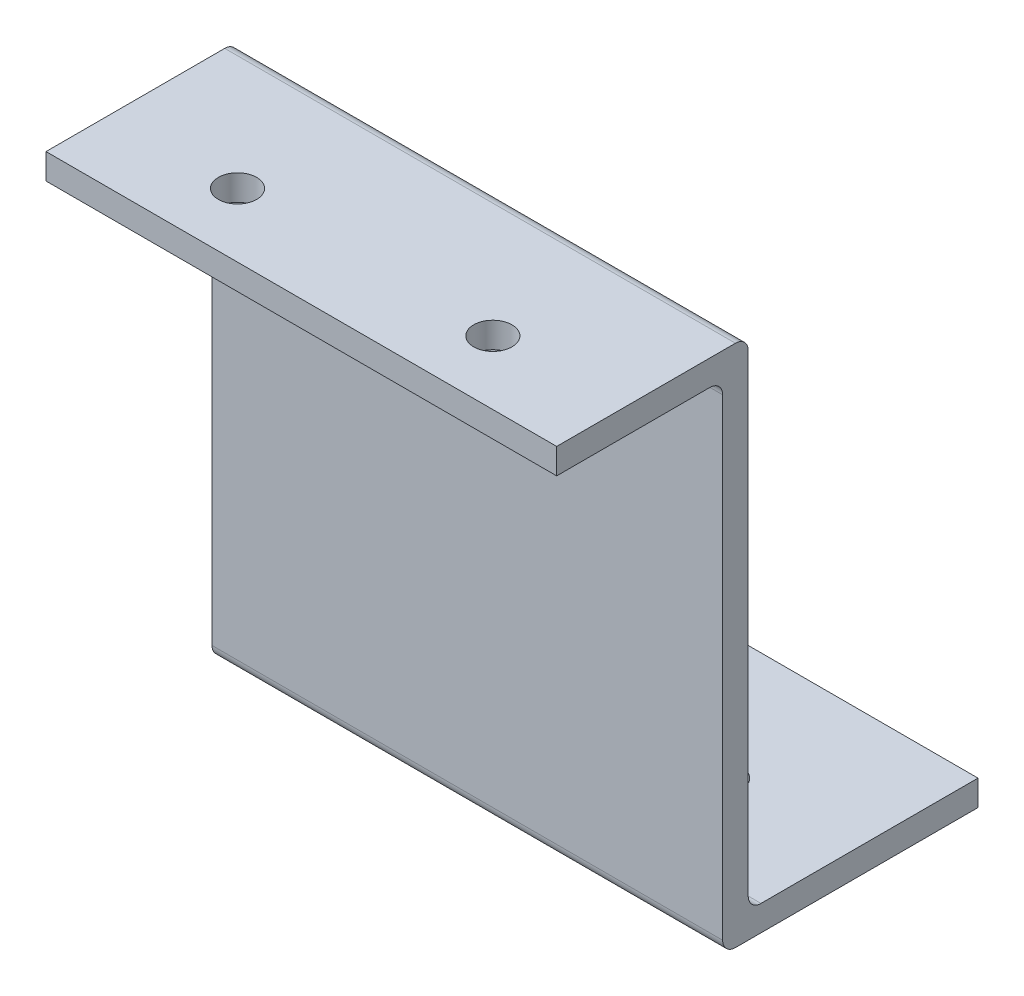
ISO-10303-21;
HEADER;
FILE_DESCRIPTION(('STEP AP214'),'2;1');
FILE_NAME('part.step','',(''),(''),'','','');
FILE_SCHEMA(('AUTOMOTIVE_DESIGN { 1 0 10303 214 1 1 1 1 }'));
ENDSEC;
DATA;
#1=APPLICATION_CONTEXT('core data for automotive mechanical design processes');
#2=APPLICATION_PROTOCOL_DEFINITION('international standard','automotive_design',2000,#1);
#3=PRODUCT_CONTEXT('',#1,'mechanical');
#4=PRODUCT('Part','Part','',(#3));
#5=PRODUCT_RELATED_PRODUCT_CATEGORY('part','',(#4));
#6=PRODUCT_DEFINITION_FORMATION('','',#4);
#7=PRODUCT_DEFINITION_CONTEXT('part definition',#1,'design');
#8=PRODUCT_DEFINITION('design','',#6,#7);
#9=PRODUCT_DEFINITION_SHAPE('','',#8);
#10=(LENGTH_UNIT() NAMED_UNIT(*) SI_UNIT(.MILLI.,.METRE.));
#11=(NAMED_UNIT(*) PLANE_ANGLE_UNIT() SI_UNIT($,.RADIAN.));
#12=(NAMED_UNIT(*) SI_UNIT($,.STERADIAN.) SOLID_ANGLE_UNIT());
#13=UNCERTAINTY_MEASURE_WITH_UNIT(LENGTH_MEASURE(1.E-05),#10,'distance_accuracy_value','');
#14=(GEOMETRIC_REPRESENTATION_CONTEXT(3) GLOBAL_UNCERTAINTY_ASSIGNED_CONTEXT((#13)) GLOBAL_UNIT_ASSIGNED_CONTEXT((#10,
#11,#12)) REPRESENTATION_CONTEXT('',''));
#15=CARTESIAN_POINT('',(0.,0.,0.));
#16=DIRECTION('',(0.,0.,1.));
#17=DIRECTION('',(1.,0.,0.));
#18=AXIS2_PLACEMENT_3D('',#15,#16,#17);
#19=CARTESIAN_POINT('',(40.,0.,0.));
#20=DIRECTION('',(0.,1.,0.));
#21=DIRECTION('',(0.,0.,1.));
#22=AXIS2_PLACEMENT_3D('',#19,#20,#21);
#23=PLANE('',#22);
#24=CARTESIAN_POINT('',(10.,0.,-5.));
#25=DIRECTION('',(0.,1.,0.));
#26=DIRECTION('',(0.,0.,1.));
#27=AXIS2_PLACEMENT_3D('',#24,#25,#26);
#28=CIRCLE('',#27,1.5);
#29=CARTESIAN_POINT('',(10.,0.,-3.5));
#30=VERTEX_POINT('',#29);
#31=EDGE_CURVE('E172',#30,#30,#28,.T.);
#32=ORIENTED_EDGE('',*,*,#31,.T.);
#33=EDGE_LOOP('',(#32));
#34=FACE_BOUND('',#33,.T.);
#35=CARTESIAN_POINT('',(30.,0.,-5.));
#36=DIRECTION('',(0.,1.,0.));
#37=DIRECTION('',(0.,0.,1.));
#38=AXIS2_PLACEMENT_3D('',#35,#36,#37);
#39=CIRCLE('',#38,1.5);
#40=CARTESIAN_POINT('',(30.,0.,-3.5));
#41=VERTEX_POINT('',#40);
#42=EDGE_CURVE('E258',#41,#41,#39,.T.);
#43=ORIENTED_EDGE('',*,*,#42,.T.);
#44=EDGE_LOOP('',(#43));
#45=FACE_BOUND('',#44,.T.);
#46=DIRECTION('',(0.,0.,-1.));
#47=VECTOR('',#46,1.);
#48=CARTESIAN_POINT('',(0.,0.,0.));
#49=LINE('',#48,#47);
#50=CARTESIAN_POINT('',(0.,0.,0.));
#51=VERTEX_POINT('',#50);
#52=CARTESIAN_POINT('',(0.,0.,-12.));
#53=VERTEX_POINT('',#52);
#54=EDGE_CURVE('E168',#51,#53,#49,.T.);
#55=ORIENTED_EDGE('',*,*,#54,.T.);
#56=DIRECTION('',(-1.,0.,0.));
#57=VECTOR('',#56,1.);
#58=CARTESIAN_POINT('',(40.,0.,-12.));
#59=LINE('',#58,#57);
#60=CARTESIAN_POINT('',(40.,0.,-12.));
#61=VERTEX_POINT('',#60);
#62=EDGE_CURVE('E210',#53,#61,#59,.F.);
#63=ORIENTED_EDGE('',*,*,#62,.T.);
#64=DIRECTION('',(0.,0.,-1.));
#65=VECTOR('',#64,1.);
#66=CARTESIAN_POINT('',(40.,0.,0.));
#67=LINE('',#66,#65);
#68=CARTESIAN_POINT('',(40.,0.,0.));
#69=VERTEX_POINT('',#68);
#70=EDGE_CURVE('E155',#69,#61,#67,.T.);
#71=ORIENTED_EDGE('',*,*,#70,.F.);
#72=DIRECTION('',(-1.,0.,0.));
#73=VECTOR('',#72,1.);
#74=CARTESIAN_POINT('',(40.,0.,0.));
#75=LINE('',#74,#73);
#76=EDGE_CURVE('E167',#69,#51,#75,.T.);
#77=ORIENTED_EDGE('',*,*,#76,.T.);
#78=EDGE_LOOP('',(#55,#63,#71,#77));
#79=FACE_BOUND('',#78,.T.);
#80=ADVANCED_FACE('F35',(#34,#45,#79),#23,.F.);
#81=CARTESIAN_POINT('',(40.,0.,-13.));
#82=DIRECTION('',(0.,0.,-1.));
#83=DIRECTION('',(-1.,0.,0.));
#84=AXIS2_PLACEMENT_3D('',#81,#82,#83);
#85=PLANE('',#84);
#86=DIRECTION('',(0.,-1.,0.));
#87=VECTOR('',#86,1.);
#88=CARTESIAN_POINT('',(0.,0.,-13.));
#89=LINE('',#88,#87);
#90=CARTESIAN_POINT('',(0.,-1.,-13.));
#91=VERTEX_POINT('',#90);
#92=CARTESIAN_POINT('',(0.,-38.,-13.));
#93=VERTEX_POINT('',#92);
#94=EDGE_CURVE('E171',#91,#93,#89,.T.);
#95=ORIENTED_EDGE('',*,*,#94,.T.);
#96=DIRECTION('',(-1.,0.,0.));
#97=VECTOR('',#96,1.);
#98=CARTESIAN_POINT('',(40.,-38.,-13.));
#99=LINE('',#98,#97);
#100=CARTESIAN_POINT('',(40.,-38.,-13.));
#101=VERTEX_POINT('',#100);
#102=EDGE_CURVE('E200',#93,#101,#99,.F.);
#103=ORIENTED_EDGE('',*,*,#102,.T.);
#104=DIRECTION('',(0.,-1.,0.));
#105=VECTOR('',#104,1.);
#106=CARTESIAN_POINT('',(40.,0.,-13.));
#107=LINE('',#106,#105);
#108=CARTESIAN_POINT('',(40.,-1.,-13.));
#109=VERTEX_POINT('',#108);
#110=EDGE_CURVE('E153',#109,#101,#107,.T.);
#111=ORIENTED_EDGE('',*,*,#110,.F.);
#112=DIRECTION('',(-1.,0.,0.));
#113=VECTOR('',#112,1.);
#114=CARTESIAN_POINT('',(0.,-1.,-13.));
#115=LINE('',#114,#113);
#116=EDGE_CURVE('E197',#109,#91,#115,.T.);
#117=ORIENTED_EDGE('',*,*,#116,.T.);
#118=EDGE_LOOP('',(#95,#103,#111,#117));
#119=FACE_BOUND('',#118,.T.);
#120=ADVANCED_FACE('F234',(#119),#85,.F.);
#121=CARTESIAN_POINT('',(40.,-39.,-1.35308431126191E-13));
#122=DIRECTION('',(0.,-1.,0.));
#123=DIRECTION('',(0.,0.,-1.));
#124=AXIS2_PLACEMENT_3D('',#121,#122,#123);
#125=PLANE('',#124);
#126=CARTESIAN_POINT('',(30.,-39.,-23.));
#127=DIRECTION('',(0.,-1.,0.));
#128=DIRECTION('',(0.,0.,-1.));
#129=AXIS2_PLACEMENT_3D('',#126,#127,#128);
#130=CIRCLE('',#129,1.5);
#131=CARTESIAN_POINT('',(30.,-39.,-24.5));
#132=VERTEX_POINT('',#131);
#133=EDGE_CURVE('E265',#132,#132,#130,.T.);
#134=ORIENTED_EDGE('',*,*,#133,.F.);
#135=EDGE_LOOP('',(#134));
#136=FACE_BOUND('',#135,.T.);
#137=CARTESIAN_POINT('',(10.,-39.,-23.));
#138=DIRECTION('',(0.,-1.,0.));
#139=DIRECTION('',(0.,0.,-1.));
#140=AXIS2_PLACEMENT_3D('',#137,#138,#139);
#141=CIRCLE('',#140,1.5);
#142=CARTESIAN_POINT('',(10.,-39.,-24.5));
#143=VERTEX_POINT('',#142);
#144=EDGE_CURVE('E270',#143,#143,#141,.T.);
#145=ORIENTED_EDGE('',*,*,#144,.F.);
#146=EDGE_LOOP('',(#145));
#147=FACE_BOUND('',#146,.T.);
#148=DIRECTION('',(0.,0.,1.));
#149=VECTOR('',#148,1.);
#150=CARTESIAN_POINT('',(40.,-39.,-1.35308431126191E-13));
#151=LINE('',#150,#149);
#152=CARTESIAN_POINT('',(40.,-39.,-33.));
#153=VERTEX_POINT('',#152);
#154=CARTESIAN_POINT('',(40.,-39.,-14.));
#155=VERTEX_POINT('',#154);
#156=EDGE_CURVE('E131',#153,#155,#151,.T.);
#157=ORIENTED_EDGE('',*,*,#156,.T.);
#158=DIRECTION('',(-1.,0.,0.));
#159=VECTOR('',#158,1.);
#160=CARTESIAN_POINT('',(0.,-39.,-14.));
#161=LINE('',#160,#159);
#162=CARTESIAN_POINT('',(0.,-39.,-14.));
#163=VERTEX_POINT('',#162);
#164=EDGE_CURVE('E138',#155,#163,#161,.T.);
#165=ORIENTED_EDGE('',*,*,#164,.T.);
#166=DIRECTION('',(0.,0.,1.));
#167=VECTOR('',#166,1.);
#168=CARTESIAN_POINT('',(0.,-39.,-1.35308431126191E-13));
#169=LINE('',#168,#167);
#170=CARTESIAN_POINT('',(0.,-39.,-33.));
#171=VERTEX_POINT('',#170);
#172=EDGE_CURVE('E134',#171,#163,#169,.T.);
#173=ORIENTED_EDGE('',*,*,#172,.F.);
#174=DIRECTION('',(-1.,0.,0.));
#175=VECTOR('',#174,1.);
#176=CARTESIAN_POINT('',(40.,-39.,-33.));
#177=LINE('',#176,#175);
#178=EDGE_CURVE('E126',#153,#171,#177,.T.);
#179=ORIENTED_EDGE('',*,*,#178,.F.);
#180=EDGE_LOOP('',(#157,#165,#173,#179));
#181=FACE_BOUND('',#180,.T.);
#182=ADVANCED_FACE('F128',(#136,#147,#181),#125,.T.);
#183=CARTESIAN_POINT('',(40.,0.,-33.));
#184=DIRECTION('',(0.,0.,1.));
#185=DIRECTION('',(1.,0.,0.));
#186=AXIS2_PLACEMENT_3D('',#183,#184,#185);
#187=PLANE('',#186);
#188=DIRECTION('',(0.,1.,0.));
#189=VECTOR('',#188,1.);
#190=CARTESIAN_POINT('',(0.,0.,-33.));
#191=LINE('',#190,#189);
#192=CARTESIAN_POINT('',(0.,-37.,-33.));
#193=VERTEX_POINT('',#192);
#194=EDGE_CURVE('E176',#171,#193,#191,.T.);
#195=ORIENTED_EDGE('',*,*,#194,.T.);
#196=DIRECTION('',(-1.,0.,0.));
#197=VECTOR('',#196,1.);
#198=CARTESIAN_POINT('',(40.,-37.,-33.));
#199=LINE('',#198,#197);
#200=CARTESIAN_POINT('',(40.,-37.,-33.));
#201=VERTEX_POINT('',#200);
#202=EDGE_CURVE('E139',#201,#193,#199,.T.);
#203=ORIENTED_EDGE('',*,*,#202,.F.);
#204=DIRECTION('',(0.,1.,0.));
#205=VECTOR('',#204,1.);
#206=CARTESIAN_POINT('',(40.,0.,-33.));
#207=LINE('',#206,#205);
#208=EDGE_CURVE('E143',#153,#201,#207,.T.);
#209=ORIENTED_EDGE('',*,*,#208,.F.);
#210=ORIENTED_EDGE('',*,*,#178,.T.);
#211=EDGE_LOOP('',(#195,#203,#209,#210));
#212=FACE_BOUND('',#211,.T.);
#213=ADVANCED_FACE('F144',(#212),#187,.F.);
#214=CARTESIAN_POINT('',(40.,-37.,0.));
#215=DIRECTION('',(0.,1.,0.));
#216=DIRECTION('',(0.,0.,1.));
#217=AXIS2_PLACEMENT_3D('',#214,#215,#216);
#218=PLANE('',#217);
#219=CARTESIAN_POINT('',(30.,-37.,-23.));
#220=DIRECTION('',(0.,1.,0.));
#221=DIRECTION('',(0.,0.,1.));
#222=AXIS2_PLACEMENT_3D('',#219,#220,#221);
#223=CIRCLE('',#222,1.5);
#224=CARTESIAN_POINT('',(30.,-37.,-21.5));
#225=VERTEX_POINT('',#224);
#226=EDGE_CURVE('E273',#225,#225,#223,.T.);
#227=ORIENTED_EDGE('',*,*,#226,.F.);
#228=EDGE_LOOP('',(#227));
#229=FACE_BOUND('',#228,.T.);
#230=CARTESIAN_POINT('',(10.,-37.,-23.));
#231=DIRECTION('',(0.,1.,0.));
#232=DIRECTION('',(0.,0.,1.));
#233=AXIS2_PLACEMENT_3D('',#230,#231,#232);
#234=CIRCLE('',#233,1.5);
#235=CARTESIAN_POINT('',(10.,-37.,-21.5));
#236=VERTEX_POINT('',#235);
#237=EDGE_CURVE('E274',#236,#236,#234,.T.);
#238=ORIENTED_EDGE('',*,*,#237,.F.);
#239=EDGE_LOOP('',(#238));
#240=FACE_BOUND('',#239,.T.);
#241=DIRECTION('',(0.,0.,-1.));
#242=VECTOR('',#241,1.);
#243=CARTESIAN_POINT('',(0.,-37.,0.));
#244=LINE('',#243,#242);
#245=CARTESIAN_POINT('',(0.,-37.,-16.));
#246=VERTEX_POINT('',#245);
#247=EDGE_CURVE('E178',#246,#193,#244,.T.);
#248=ORIENTED_EDGE('',*,*,#247,.F.);
#249=DIRECTION('',(-1.,0.,0.));
#250=VECTOR('',#249,1.);
#251=CARTESIAN_POINT('',(40.,-37.,-16.));
#252=LINE('',#251,#250);
#253=CARTESIAN_POINT('',(40.,-37.,-16.));
#254=VERTEX_POINT('',#253);
#255=EDGE_CURVE('E208',#246,#254,#252,.F.);
#256=ORIENTED_EDGE('',*,*,#255,.T.);
#257=DIRECTION('',(0.,0.,-1.));
#258=VECTOR('',#257,1.);
#259=CARTESIAN_POINT('',(40.,-37.,0.));
#260=LINE('',#259,#258);
#261=EDGE_CURVE('E147',#254,#201,#260,.T.);
#262=ORIENTED_EDGE('',*,*,#261,.T.);
#263=ORIENTED_EDGE('',*,*,#202,.T.);
#264=EDGE_LOOP('',(#248,#256,#262,#263));
#265=FACE_BOUND('',#264,.T.);
#266=ADVANCED_FACE('F242',(#229,#240,#265),#218,.T.);
#267=CARTESIAN_POINT('',(40.,0.,-15.));
#268=DIRECTION('',(0.,0.,1.));
#269=DIRECTION('',(1.,0.,0.));
#270=AXIS2_PLACEMENT_3D('',#267,#268,#269);
#271=PLANE('',#270);
#272=DIRECTION('',(0.,1.,0.));
#273=VECTOR('',#272,1.);
#274=CARTESIAN_POINT('',(40.,0.,-15.));
#275=LINE('',#274,#273);
#276=CARTESIAN_POINT('',(40.,-36.,-15.));
#277=VERTEX_POINT('',#276);
#278=CARTESIAN_POINT('',(40.,1.,-15.));
#279=VERTEX_POINT('',#278);
#280=EDGE_CURVE('E160',#277,#279,#275,.T.);
#281=ORIENTED_EDGE('',*,*,#280,.F.);
#282=DIRECTION('',(-1.,0.,0.));
#283=VECTOR('',#282,1.);
#284=CARTESIAN_POINT('',(40.,-36.,-15.));
#285=LINE('',#284,#283);
#286=CARTESIAN_POINT('',(0.,-36.,-15.));
#287=VERTEX_POINT('',#286);
#288=EDGE_CURVE('E205',#277,#287,#285,.T.);
#289=ORIENTED_EDGE('',*,*,#288,.T.);
#290=DIRECTION('',(0.,1.,0.));
#291=VECTOR('',#290,1.);
#292=CARTESIAN_POINT('',(0.,0.,-15.));
#293=LINE('',#292,#291);
#294=CARTESIAN_POINT('',(0.,1.,-15.));
#295=VERTEX_POINT('',#294);
#296=EDGE_CURVE('E180',#287,#295,#293,.T.);
#297=ORIENTED_EDGE('',*,*,#296,.T.);
#298=DIRECTION('',(-1.,0.,0.));
#299=VECTOR('',#298,1.);
#300=CARTESIAN_POINT('',(40.,1.,-15.));
#301=LINE('',#300,#299);
#302=EDGE_CURVE('E58',#295,#279,#301,.F.);
#303=ORIENTED_EDGE('',*,*,#302,.T.);
#304=EDGE_LOOP('',(#281,#289,#297,#303));
#305=FACE_BOUND('',#304,.T.);
#306=ADVANCED_FACE('F247',(#305),#271,.F.);
#307=CARTESIAN_POINT('',(40.,2.,0.));
#308=DIRECTION('',(0.,1.,0.));
#309=DIRECTION('',(0.,0.,1.));
#310=AXIS2_PLACEMENT_3D('',#307,#308,#309);
#311=PLANE('',#310);
#312=CARTESIAN_POINT('',(10.,2.,-5.));
#313=DIRECTION('',(0.,1.,0.));
#314=DIRECTION('',(0.,0.,1.));
#315=AXIS2_PLACEMENT_3D('',#312,#313,#314);
#316=CIRCLE('',#315,1.5);
#317=CARTESIAN_POINT('',(10.,2.,-3.5));
#318=VERTEX_POINT('',#317);
#319=EDGE_CURVE('E261',#318,#318,#316,.T.);
#320=ORIENTED_EDGE('',*,*,#319,.F.);
#321=EDGE_LOOP('',(#320));
#322=FACE_BOUND('',#321,.T.);
#323=CARTESIAN_POINT('',(30.,2.,-5.));
#324=DIRECTION('',(0.,1.,0.));
#325=DIRECTION('',(0.,0.,1.));
#326=AXIS2_PLACEMENT_3D('',#323,#324,#325);
#327=CIRCLE('',#326,1.5);
#328=CARTESIAN_POINT('',(30.,2.,-3.5));
#329=VERTEX_POINT('',#328);
#330=EDGE_CURVE('E262',#329,#329,#327,.T.);
#331=ORIENTED_EDGE('',*,*,#330,.F.);
#332=EDGE_LOOP('',(#331));
#333=FACE_BOUND('',#332,.T.);
#334=DIRECTION('',(0.,0.,-1.));
#335=VECTOR('',#334,1.);
#336=CARTESIAN_POINT('',(40.,2.,0.));
#337=LINE('',#336,#335);
#338=CARTESIAN_POINT('',(40.,2.,0.));
#339=VERTEX_POINT('',#338);
#340=CARTESIAN_POINT('',(40.,2.,-14.));
#341=VERTEX_POINT('',#340);
#342=EDGE_CURVE('E162',#339,#341,#337,.T.);
#343=ORIENTED_EDGE('',*,*,#342,.T.);
#344=DIRECTION('',(-1.,0.,0.));
#345=VECTOR('',#344,1.);
#346=CARTESIAN_POINT('',(0.,2.,-14.));
#347=LINE('',#346,#345);
#348=CARTESIAN_POINT('',(0.,2.,-14.));
#349=VERTEX_POINT('',#348);
#350=EDGE_CURVE('E212',#341,#349,#347,.T.);
#351=ORIENTED_EDGE('',*,*,#350,.T.);
#352=DIRECTION('',(0.,0.,-1.));
#353=VECTOR('',#352,1.);
#354=CARTESIAN_POINT('',(0.,2.,0.));
#355=LINE('',#354,#353);
#356=CARTESIAN_POINT('',(0.,2.,0.));
#357=VERTEX_POINT('',#356);
#358=EDGE_CURVE('E182',#357,#349,#355,.T.);
#359=ORIENTED_EDGE('',*,*,#358,.F.);
#360=DIRECTION('',(-1.,0.,0.));
#361=VECTOR('',#360,1.);
#362=CARTESIAN_POINT('',(40.,2.,0.));
#363=LINE('',#362,#361);
#364=EDGE_CURVE('E189',#339,#357,#363,.T.);
#365=ORIENTED_EDGE('',*,*,#364,.F.);
#366=EDGE_LOOP('',(#343,#351,#359,#365));
#367=FACE_BOUND('',#366,.T.);
#368=ADVANCED_FACE('F252',(#322,#333,#367),#311,.T.);
#369=CARTESIAN_POINT('',(40.,0.,0.));
#370=DIRECTION('',(0.,0.,1.));
#371=DIRECTION('',(1.,0.,0.));
#372=AXIS2_PLACEMENT_3D('',#369,#370,#371);
#373=PLANE('',#372);
#374=DIRECTION('',(0.,1.,0.));
#375=VECTOR('',#374,1.);
#376=CARTESIAN_POINT('',(0.,0.,0.));
#377=LINE('',#376,#375);
#378=EDGE_CURVE('E185',#51,#357,#377,.T.);
#379=ORIENTED_EDGE('',*,*,#378,.F.);
#380=ORIENTED_EDGE('',*,*,#76,.F.);
#381=DIRECTION('',(0.,1.,0.));
#382=VECTOR('',#381,1.);
#383=CARTESIAN_POINT('',(40.,0.,0.));
#384=LINE('',#383,#382);
#385=EDGE_CURVE('E164',#69,#339,#384,.T.);
#386=ORIENTED_EDGE('',*,*,#385,.T.);
#387=ORIENTED_EDGE('',*,*,#364,.T.);
#388=EDGE_LOOP('',(#379,#380,#386,#387));
#389=FACE_BOUND('',#388,.T.);
#390=ADVANCED_FACE('F254',(#389),#373,.T.);
#391=CARTESIAN_POINT('',(40.,0.,0.));
#392=DIRECTION('',(1.,0.,0.));
#393=DIRECTION('',(0.,0.,-1.));
#394=AXIS2_PLACEMENT_3D('',#391,#392,#393);
#395=PLANE('',#394);
#396=ORIENTED_EDGE('',*,*,#110,.T.);
#397=CARTESIAN_POINT('',(40.,-38.,-14.));
#398=DIRECTION('',(1.,0.,0.));
#399=DIRECTION('',(0.,0.,-1.));
#400=AXIS2_PLACEMENT_3D('',#397,#398,#399);
#401=CIRCLE('',#400,1.);
#402=EDGE_CURVE('E152',#101,#155,#401,.T.);
#403=ORIENTED_EDGE('',*,*,#402,.T.);
#404=ORIENTED_EDGE('',*,*,#156,.F.);
#405=ORIENTED_EDGE('',*,*,#208,.T.);
#406=ORIENTED_EDGE('',*,*,#261,.F.);
#407=CARTESIAN_POINT('',(40.,-36.,-16.));
#408=DIRECTION('',(1.,0.,0.));
#409=DIRECTION('',(0.,0.,-1.));
#410=AXIS2_PLACEMENT_3D('',#407,#408,#409);
#411=CIRCLE('',#410,1.);
#412=EDGE_CURVE('E217',#254,#277,#411,.F.);
#413=ORIENTED_EDGE('',*,*,#412,.T.);
#414=ORIENTED_EDGE('',*,*,#280,.T.);
#415=CARTESIAN_POINT('',(40.,1.,-14.));
#416=DIRECTION('',(1.,0.,0.));
#417=DIRECTION('',(0.,0.,-1.));
#418=AXIS2_PLACEMENT_3D('',#415,#416,#417);
#419=CIRCLE('',#418,1.);
#420=EDGE_CURVE('E50',#279,#341,#419,.T.);
#421=ORIENTED_EDGE('',*,*,#420,.T.);
#422=ORIENTED_EDGE('',*,*,#342,.F.);
#423=ORIENTED_EDGE('',*,*,#385,.F.);
#424=ORIENTED_EDGE('',*,*,#70,.T.);
#425=CARTESIAN_POINT('',(40.,-1.,-12.));
#426=DIRECTION('',(1.,0.,0.));
#427=DIRECTION('',(0.,0.,-1.));
#428=AXIS2_PLACEMENT_3D('',#425,#426,#427);
#429=CIRCLE('',#428,1.);
#430=EDGE_CURVE('E11',#61,#109,#429,.F.);
#431=ORIENTED_EDGE('',*,*,#430,.T.);
#432=EDGE_LOOP('',(#396,#403,#404,#405,#406,#413,#414,#421,#422,#423,#424,#431));
#433=FACE_BOUND('',#432,.T.);
#434=ADVANCED_FACE('F150',(#433),#395,.T.);
#435=CARTESIAN_POINT('',(0.,0.,0.));
#436=DIRECTION('',(1.,0.,0.));
#437=DIRECTION('',(0.,0.,-1.));
#438=AXIS2_PLACEMENT_3D('',#435,#436,#437);
#439=PLANE('',#438);
#440=ORIENTED_EDGE('',*,*,#172,.T.);
#441=CARTESIAN_POINT('',(0.,-38.,-14.));
#442=DIRECTION('',(1.,0.,0.));
#443=DIRECTION('',(0.,0.,-1.));
#444=AXIS2_PLACEMENT_3D('',#441,#442,#443);
#445=CIRCLE('',#444,1.);
#446=EDGE_CURVE('E195',#163,#93,#445,.F.);
#447=ORIENTED_EDGE('',*,*,#446,.T.);
#448=ORIENTED_EDGE('',*,*,#94,.F.);
#449=CARTESIAN_POINT('',(0.,-1.,-12.));
#450=DIRECTION('',(1.,0.,0.));
#451=DIRECTION('',(0.,0.,-1.));
#452=AXIS2_PLACEMENT_3D('',#449,#450,#451);
#453=CIRCLE('',#452,1.);
#454=EDGE_CURVE('E43',#91,#53,#453,.T.);
#455=ORIENTED_EDGE('',*,*,#454,.T.);
#456=ORIENTED_EDGE('',*,*,#54,.F.);
#457=ORIENTED_EDGE('',*,*,#378,.T.);
#458=ORIENTED_EDGE('',*,*,#358,.T.);
#459=CARTESIAN_POINT('',(0.,1.,-14.));
#460=DIRECTION('',(1.,0.,0.));
#461=DIRECTION('',(0.,0.,-1.));
#462=AXIS2_PLACEMENT_3D('',#459,#460,#461);
#463=CIRCLE('',#462,1.);
#464=EDGE_CURVE('E193',#349,#295,#463,.F.);
#465=ORIENTED_EDGE('',*,*,#464,.T.);
#466=ORIENTED_EDGE('',*,*,#296,.F.);
#467=CARTESIAN_POINT('',(0.,-36.,-16.));
#468=DIRECTION('',(1.,0.,0.));
#469=DIRECTION('',(0.,0.,-1.));
#470=AXIS2_PLACEMENT_3D('',#467,#468,#469);
#471=CIRCLE('',#470,1.);
#472=EDGE_CURVE('E215',#287,#246,#471,.T.);
#473=ORIENTED_EDGE('',*,*,#472,.T.);
#474=ORIENTED_EDGE('',*,*,#247,.T.);
#475=ORIENTED_EDGE('',*,*,#194,.F.);
#476=EDGE_LOOP('',(#440,#447,#448,#455,#456,#457,#458,#465,#466,#473,#474,#475));
#477=FACE_BOUND('',#476,.T.);
#478=ADVANCED_FACE('F221',(#477),#439,.F.);
#479=CARTESIAN_POINT('',(30.,-38.,-5.));
#480=DIRECTION('',(0.,1.,0.));
#481=DIRECTION('',(0.,0.,1.));
#482=AXIS2_PLACEMENT_3D('',#479,#480,#481);
#483=CYLINDRICAL_SURFACE('',#482,1.5);
#484=ORIENTED_EDGE('',*,*,#330,.T.);
#485=EDGE_LOOP('',(#484));
#486=FACE_BOUND('',#485,.T.);
#487=ORIENTED_EDGE('',*,*,#42,.F.);
#488=EDGE_LOOP('',(#487));
#489=FACE_BOUND('',#488,.T.);
#490=ADVANCED_FACE('F386',(#486,#489),#483,.F.);
#491=CARTESIAN_POINT('',(10.,-38.,-5.));
#492=DIRECTION('',(0.,1.,0.));
#493=DIRECTION('',(0.,0.,1.));
#494=AXIS2_PLACEMENT_3D('',#491,#492,#493);
#495=CYLINDRICAL_SURFACE('',#494,1.5);
#496=ORIENTED_EDGE('',*,*,#319,.T.);
#497=EDGE_LOOP('',(#496));
#498=FACE_BOUND('',#497,.T.);
#499=ORIENTED_EDGE('',*,*,#31,.F.);
#500=EDGE_LOOP('',(#499));
#501=FACE_BOUND('',#500,.T.);
#502=ADVANCED_FACE('F310',(#498,#501),#495,.F.);
#503=CARTESIAN_POINT('',(40.,-38.,-14.));
#504=DIRECTION('',(1.,0.,0.));
#505=DIRECTION('',(0.,0.,-1.));
#506=AXIS2_PLACEMENT_3D('',#503,#504,#505);
#507=CYLINDRICAL_SURFACE('',#506,1.);
#508=ORIENTED_EDGE('',*,*,#402,.F.);
#509=ORIENTED_EDGE('',*,*,#102,.F.);
#510=ORIENTED_EDGE('',*,*,#446,.F.);
#511=ORIENTED_EDGE('',*,*,#164,.F.);
#512=EDGE_LOOP('',(#508,#509,#510,#511));
#513=FACE_BOUND('',#512,.T.);
#514=ADVANCED_FACE('F237',(#513),#507,.T.);
#515=CARTESIAN_POINT('',(40.,-36.,-16.));
#516=DIRECTION('',(-1.,0.,0.));
#517=DIRECTION('',(0.,0.,1.));
#518=AXIS2_PLACEMENT_3D('',#515,#516,#517);
#519=CYLINDRICAL_SURFACE('',#518,1.);
#520=ORIENTED_EDGE('',*,*,#412,.F.);
#521=ORIENTED_EDGE('',*,*,#255,.F.);
#522=ORIENTED_EDGE('',*,*,#472,.F.);
#523=ORIENTED_EDGE('',*,*,#288,.F.);
#524=EDGE_LOOP('',(#520,#521,#522,#523));
#525=FACE_BOUND('',#524,.T.);
#526=ADVANCED_FACE('F246',(#525),#519,.F.);
#527=CARTESIAN_POINT('',(40.,-1.,-12.));
#528=DIRECTION('',(1.,0.,0.));
#529=DIRECTION('',(0.,0.,-1.));
#530=AXIS2_PLACEMENT_3D('',#527,#528,#529);
#531=CYLINDRICAL_SURFACE('',#530,1.);
#532=ORIENTED_EDGE('',*,*,#430,.F.);
#533=ORIENTED_EDGE('',*,*,#62,.F.);
#534=ORIENTED_EDGE('',*,*,#454,.F.);
#535=ORIENTED_EDGE('',*,*,#116,.F.);
#536=EDGE_LOOP('',(#532,#533,#534,#535));
#537=FACE_BOUND('',#536,.T.);
#538=ADVANCED_FACE('F230',(#537),#531,.F.);
#539=CARTESIAN_POINT('',(40.,1.,-14.));
#540=DIRECTION('',(1.,0.,0.));
#541=DIRECTION('',(0.,0.,-1.));
#542=AXIS2_PLACEMENT_3D('',#539,#540,#541);
#543=CYLINDRICAL_SURFACE('',#542,1.);
#544=ORIENTED_EDGE('',*,*,#420,.F.);
#545=ORIENTED_EDGE('',*,*,#302,.F.);
#546=ORIENTED_EDGE('',*,*,#464,.F.);
#547=ORIENTED_EDGE('',*,*,#350,.F.);
#548=EDGE_LOOP('',(#544,#545,#546,#547));
#549=FACE_BOUND('',#548,.T.);
#550=ADVANCED_FACE('F37',(#549),#543,.T.);
#551=CARTESIAN_POINT('',(10.,-77.,-23.));
#552=DIRECTION('',(0.,1.,0.));
#553=DIRECTION('',(0.,0.,1.));
#554=AXIS2_PLACEMENT_3D('',#551,#552,#553);
#555=CYLINDRICAL_SURFACE('',#554,1.5);
#556=ORIENTED_EDGE('',*,*,#144,.T.);
#557=EDGE_LOOP('',(#556));
#558=FACE_BOUND('',#557,.T.);
#559=ORIENTED_EDGE('',*,*,#237,.T.);
#560=EDGE_LOOP('',(#559));
#561=FACE_BOUND('',#560,.T.);
#562=ADVANCED_FACE('F287',(#558,#561),#555,.F.);
#563=CARTESIAN_POINT('',(30.,-77.,-23.));
#564=DIRECTION('',(0.,1.,0.));
#565=DIRECTION('',(0.,0.,1.));
#566=AXIS2_PLACEMENT_3D('',#563,#564,#565);
#567=CYLINDRICAL_SURFACE('',#566,1.5);
#568=ORIENTED_EDGE('',*,*,#133,.T.);
#569=EDGE_LOOP('',(#568));
#570=FACE_BOUND('',#569,.T.);
#571=ORIENTED_EDGE('',*,*,#226,.T.);
#572=EDGE_LOOP('',(#571));
#573=FACE_BOUND('',#572,.T.);
#574=ADVANCED_FACE('F280',(#570,#573),#567,.F.);
#575=CLOSED_SHELL('',(#80,#120,#182,#213,#266,#306,#368,#390,#434,#478,#490,#502,#514,#526,#538,
#550,#562,#574));
#576=MANIFOLD_SOLID_BREP('B2',#575);
#577=ADVANCED_BREP_SHAPE_REPRESENTATION('',(#18,#576),#14);
#578=SHAPE_DEFINITION_REPRESENTATION(#9,#577);
ENDSEC;
END-ISO-10303-21;
